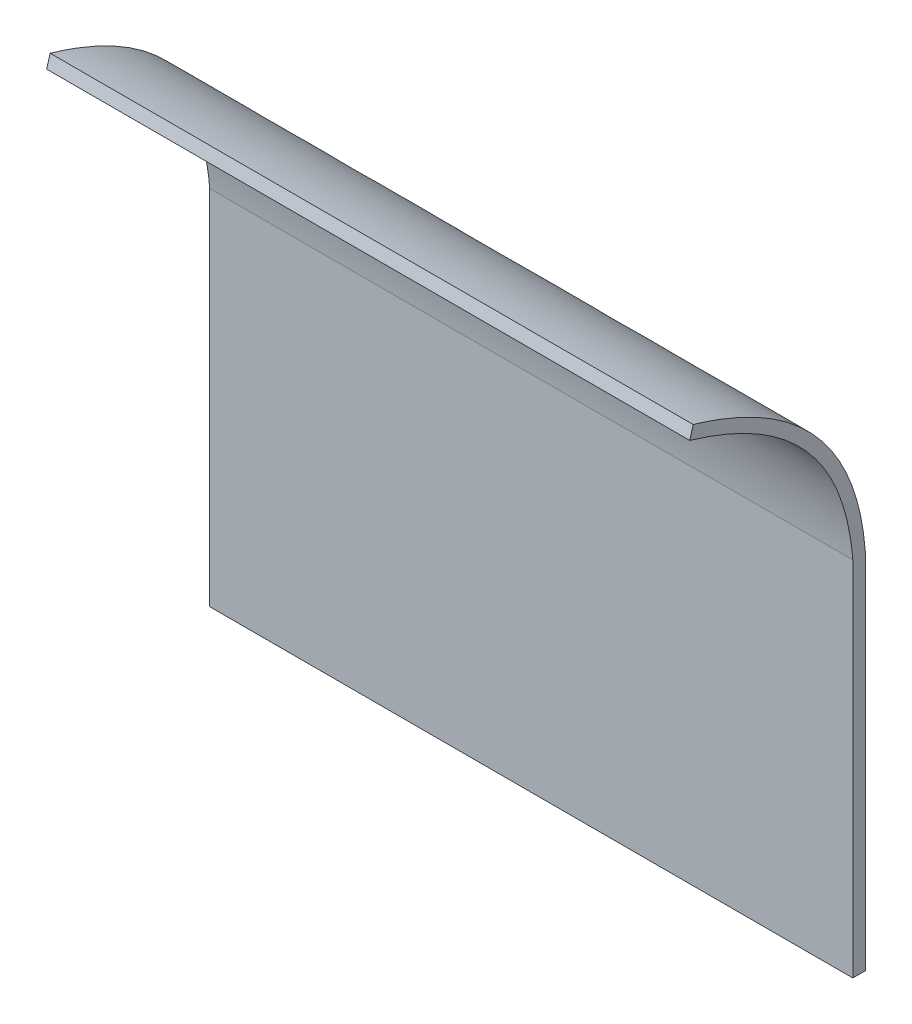
ISO-10303-21;
HEADER;
FILE_DESCRIPTION(('STEP AP214'),'2;1');
FILE_NAME('part.step','',(''),(''),'','','');
FILE_SCHEMA(('AUTOMOTIVE_DESIGN { 1 0 10303 214 1 1 1 1 }'));
ENDSEC;
DATA;
#1=APPLICATION_CONTEXT('core data for automotive mechanical design processes');
#2=APPLICATION_PROTOCOL_DEFINITION('international standard','automotive_design',2000,#1);
#3=PRODUCT_CONTEXT('',#1,'mechanical');
#4=PRODUCT('Part','Part','',(#3));
#5=PRODUCT_RELATED_PRODUCT_CATEGORY('part','',(#4));
#6=PRODUCT_DEFINITION_FORMATION('','',#4);
#7=PRODUCT_DEFINITION_CONTEXT('part definition',#1,'design');
#8=PRODUCT_DEFINITION('design','',#6,#7);
#9=PRODUCT_DEFINITION_SHAPE('','',#8);
#10=(LENGTH_UNIT() NAMED_UNIT(*) SI_UNIT(.MILLI.,.METRE.));
#11=(NAMED_UNIT(*) PLANE_ANGLE_UNIT() SI_UNIT($,.RADIAN.));
#12=(NAMED_UNIT(*) SI_UNIT($,.STERADIAN.) SOLID_ANGLE_UNIT());
#13=UNCERTAINTY_MEASURE_WITH_UNIT(LENGTH_MEASURE(1.E-05),#10,'distance_accuracy_value','');
#14=(GEOMETRIC_REPRESENTATION_CONTEXT(3) GLOBAL_UNCERTAINTY_ASSIGNED_CONTEXT((#13)) GLOBAL_UNIT_ASSIGNED_CONTEXT((#10,
#11,#12)) REPRESENTATION_CONTEXT('',''));
#15=CARTESIAN_POINT('',(0.,0.,0.));
#16=DIRECTION('',(0.,0.,1.));
#17=DIRECTION('',(1.,0.,0.));
#18=AXIS2_PLACEMENT_3D('',#15,#16,#17);
#19=CARTESIAN_POINT('',(102.5,87.1976753279063,7.81603755501328));
#20=CARTESIAN_POINT('',(102.5,84.4866748451525,-1.45819914243898));
#21=CARTESIAN_POINT('',(102.5,76.5134194247029,-11.2355541164942));
#22=CARTESIAN_POINT('',(102.5,66.2372134519051,-17.4936835132744));
#23=CARTESIAN_POINT('',(102.5,57.7198474176655,-18.1758441814915));
#24=B_SPLINE_CURVE_WITH_KNOTS('',2,(#19,#20,#21,#22,#23),.UNSPECIFIED.,.F.,.F.,(3,1,1,3),
(0.581934288562129,0.738708930351331,0.843225358210798,1.),.UNSPECIFIED.);
#25=DIRECTION('',(-1.,0.,0.));
#26=VECTOR('',#25,1.);
#27=SURFACE_OF_LINEAR_EXTRUSION('',#24,#26);
#28=CARTESIAN_POINT('',(0.,87.1976753279063,7.81603755501328));
#29=CARTESIAN_POINT('',(0.,84.4866748451525,-1.45819914243898));
#30=CARTESIAN_POINT('',(0.,76.5134194247029,-11.2355541164942));
#31=CARTESIAN_POINT('',(0.,66.2372134519051,-17.4936835132744));
#32=CARTESIAN_POINT('',(0.,57.7198474176655,-18.1758441814915));
#33=B_SPLINE_CURVE_WITH_KNOTS('',2,(#28,#29,#30,#31,#32),.UNSPECIFIED.,.F.,.F.,(3,1,1,3),
(0.581934288562129,0.738708930351331,0.843225358210798,1.),.UNSPECIFIED.);
#34=CARTESIAN_POINT('',(0.,87.1976753279063,7.81603755501328));
#35=VERTEX_POINT('',#34);
#36=CARTESIAN_POINT('',(0.,57.7198474176655,-18.1758441814915));
#37=VERTEX_POINT('',#36);
#38=EDGE_CURVE('E153',#35,#37,#33,.T.);
#39=ORIENTED_EDGE('',*,*,#38,.T.);
#40=DIRECTION('',(-1.,0.,0.));
#41=VECTOR('',#40,1.);
#42=CARTESIAN_POINT('',(102.5,57.7198474176655,-18.1758441814915));
#43=LINE('',#42,#41);
#44=CARTESIAN_POINT('',(102.5,57.7198474176655,-18.1758441814915));
#45=VERTEX_POINT('',#44);
#46=EDGE_CURVE('E11',#45,#37,#43,.T.);
#47=ORIENTED_EDGE('',*,*,#46,.F.);
#48=CARTESIAN_POINT('',(102.5,87.1976753279063,7.81603755501328));
#49=VERTEX_POINT('',#48);
#50=EDGE_CURVE('E166',#49,#45,#24,.T.);
#51=ORIENTED_EDGE('',*,*,#50,.F.);
#52=DIRECTION('',(-1.,0.,0.));
#53=VECTOR('',#52,1.);
#54=CARTESIAN_POINT('',(102.5,87.1976753279063,7.81603755501328));
#55=LINE('',#54,#53);
#56=EDGE_CURVE('E118',#49,#35,#55,.T.);
#57=ORIENTED_EDGE('',*,*,#56,.T.);
#58=EDGE_LOOP('',(#39,#47,#51,#57));
#59=FACE_BOUND('',#58,.T.);
#60=ADVANCED_FACE('F37',(#59),#27,.F.);
#61=CARTESIAN_POINT('',(102.5,57.7198474176655,-18.1758441814915));
#62=DIRECTION('',(0.,0.,-1.));
#63=DIRECTION('',(0.,1.,0.));
#64=AXIS2_PLACEMENT_3D('',#61,#62,#63);
#65=PLANE('',#64);
#66=DIRECTION('',(0.,-1.,0.));
#67=VECTOR('',#66,1.);
#68=CARTESIAN_POINT('',(0.,57.7198474176655,-18.1758441814915));
#69=LINE('',#68,#67);
#70=CARTESIAN_POINT('',(0.,0.,-18.1758441814915));
#71=VERTEX_POINT('',#70);
#72=EDGE_CURVE('E145',#37,#71,#69,.T.);
#73=ORIENTED_EDGE('',*,*,#72,.T.);
#74=DIRECTION('',(-1.,0.,0.));
#75=VECTOR('',#74,1.);
#76=CARTESIAN_POINT('',(102.5,0.,-18.1758441814915));
#77=LINE('',#76,#75);
#78=CARTESIAN_POINT('',(102.5,0.,-18.1758441814915));
#79=VERTEX_POINT('',#78);
#80=EDGE_CURVE('E46',#79,#71,#77,.T.);
#81=ORIENTED_EDGE('',*,*,#80,.F.);
#82=DIRECTION('',(0.,-1.,0.));
#83=VECTOR('',#82,1.);
#84=CARTESIAN_POINT('',(102.5,57.7198474176655,-18.1758441814915));
#85=LINE('',#84,#83);
#86=EDGE_CURVE('E91',#45,#79,#85,.T.);
#87=ORIENTED_EDGE('',*,*,#86,.F.);
#88=ORIENTED_EDGE('',*,*,#46,.T.);
#89=EDGE_LOOP('',(#73,#81,#87,#88));
#90=FACE_BOUND('',#89,.T.);
#91=ADVANCED_FACE('F138',(#90),#65,.F.);
#92=CARTESIAN_POINT('',(102.5,0.,-20.1758441814915));
#93=DIRECTION('',(0.,1.,0.));
#94=DIRECTION('',(0.,0.,1.));
#95=AXIS2_PLACEMENT_3D('',#92,#93,#94);
#96=PLANE('',#95);
#97=DIRECTION('',(0.,0.,-1.));
#98=VECTOR('',#97,1.);
#99=CARTESIAN_POINT('',(0.,0.,-20.1758441814915));
#100=LINE('',#99,#98);
#101=CARTESIAN_POINT('',(0.,0.,-20.1758441814915));
#102=VERTEX_POINT('',#101);
#103=EDGE_CURVE('E152',#71,#102,#100,.T.);
#104=ORIENTED_EDGE('',*,*,#103,.T.);
#105=DIRECTION('',(-1.,0.,0.));
#106=VECTOR('',#105,1.);
#107=CARTESIAN_POINT('',(102.5,0.,-20.1758441814915));
#108=LINE('',#107,#106);
#109=CARTESIAN_POINT('',(102.5,0.,-20.1758441814915));
#110=VERTEX_POINT('',#109);
#111=EDGE_CURVE('E113',#110,#102,#108,.T.);
#112=ORIENTED_EDGE('',*,*,#111,.F.);
#113=DIRECTION('',(0.,0.,-1.));
#114=VECTOR('',#113,1.);
#115=CARTESIAN_POINT('',(102.5,0.,-20.1758441814915));
#116=LINE('',#115,#114);
#117=EDGE_CURVE('E104',#79,#110,#116,.T.);
#118=ORIENTED_EDGE('',*,*,#117,.F.);
#119=ORIENTED_EDGE('',*,*,#80,.T.);
#120=EDGE_LOOP('',(#104,#112,#118,#119));
#121=FACE_BOUND('',#120,.T.);
#122=ADVANCED_FACE('F136',(#121),#96,.F.);
#123=CARTESIAN_POINT('',(102.5,57.796560731168,-20.1758441814915));
#124=DIRECTION('',(0.,0.,1.));
#125=DIRECTION('',(1.,0.,0.));
#126=AXIS2_PLACEMENT_3D('',#123,#124,#125);
#127=PLANE('',#126);
#128=DIRECTION('',(0.,1.,0.));
#129=VECTOR('',#128,1.);
#130=CARTESIAN_POINT('',(0.,57.796560731168,-20.1758441814915));
#131=LINE('',#130,#129);
#132=CARTESIAN_POINT('',(0.,57.796560731168,-20.1758441814915));
#133=VERTEX_POINT('',#132);
#134=EDGE_CURVE('E112',#102,#133,#131,.T.);
#135=ORIENTED_EDGE('',*,*,#134,.T.);
#136=DIRECTION('',(-1.,0.,0.));
#137=VECTOR('',#136,1.);
#138=CARTESIAN_POINT('',(102.5,57.796560731168,-20.1758441814915));
#139=LINE('',#138,#137);
#140=CARTESIAN_POINT('',(102.5,57.796560731168,-20.1758441814915));
#141=VERTEX_POINT('',#140);
#142=EDGE_CURVE('E109',#141,#133,#139,.T.);
#143=ORIENTED_EDGE('',*,*,#142,.F.);
#144=DIRECTION('',(0.,1.,0.));
#145=VECTOR('',#144,1.);
#146=CARTESIAN_POINT('',(102.5,57.796560731168,-20.1758441814915));
#147=LINE('',#146,#145);
#148=EDGE_CURVE('E98',#110,#141,#147,.T.);
#149=ORIENTED_EDGE('',*,*,#148,.F.);
#150=ORIENTED_EDGE('',*,*,#111,.T.);
#151=EDGE_LOOP('',(#135,#143,#149,#150));
#152=FACE_BOUND('',#151,.T.);
#153=ADVANCED_FACE('F110',(#152),#127,.F.);
#154=CARTESIAN_POINT('',(102.5,57.796560731168,-20.1758441814915));
#155=CARTESIAN_POINT('',(102.5,81.6963399003061,-18.3600041809931));
#156=CARTESIAN_POINT('',(102.5,89.1186802484812,7.25949456913799));
#157=B_SPLINE_CURVE_WITH_KNOTS('',2,(#154,#155,#156),.UNSPECIFIED.,.F.,.F.,(3,3),
(0.581248730237877,1.),.UNSPECIFIED.);
#158=DIRECTION('',(-1.,0.,0.));
#159=VECTOR('',#158,1.);
#160=SURFACE_OF_LINEAR_EXTRUSION('',#157,#159);
#161=CARTESIAN_POINT('',(0.,57.796560731168,-20.1758441814915));
#162=CARTESIAN_POINT('',(0.,81.6963399003061,-18.3600041809931));
#163=CARTESIAN_POINT('',(0.,89.1186802484812,7.25949456913799));
#164=B_SPLINE_CURVE_WITH_KNOTS('',2,(#161,#162,#163),.UNSPECIFIED.,.F.,.F.,(3,3),
(0.581248730237877,1.),.UNSPECIFIED.);
#165=CARTESIAN_POINT('',(0.,89.1186802484812,7.25949456913799));
#166=VERTEX_POINT('',#165);
#167=EDGE_CURVE('E77',#133,#166,#164,.T.);
#168=ORIENTED_EDGE('',*,*,#167,.T.);
#169=DIRECTION('',(-1.,0.,0.));
#170=VECTOR('',#169,1.);
#171=CARTESIAN_POINT('',(102.5,89.1186802484812,7.25949456913799));
#172=LINE('',#171,#170);
#173=CARTESIAN_POINT('',(102.5,89.1186802484812,7.25949456913799));
#174=VERTEX_POINT('',#173);
#175=EDGE_CURVE('E114',#174,#166,#172,.T.);
#176=ORIENTED_EDGE('',*,*,#175,.F.);
#177=EDGE_CURVE('E102',#141,#174,#157,.T.);
#178=ORIENTED_EDGE('',*,*,#177,.F.);
#179=ORIENTED_EDGE('',*,*,#142,.T.);
#180=EDGE_LOOP('',(#168,#176,#178,#179));
#181=FACE_BOUND('',#180,.T.);
#182=ADVANCED_FACE('F116',(#181),#160,.F.);
#183=CARTESIAN_POINT('',(102.5,89.1186802484812,7.25949456913799));
#184=DIRECTION('',(0.,-0.278271492937643,-0.960502460287456));
#185=DIRECTION('',(0.,0.960502460287456,-0.278271492937643));
#186=AXIS2_PLACEMENT_3D('',#183,#184,#185);
#187=PLANE('',#186);
#188=DIRECTION('',(0.,-0.960502460287456,0.278271492937643));
#189=VECTOR('',#188,1.);
#190=CARTESIAN_POINT('',(0.,89.1186802484812,7.25949456913799));
#191=LINE('',#190,#189);
#192=EDGE_CURVE('E83',#166,#35,#191,.T.);
#193=ORIENTED_EDGE('',*,*,#192,.T.);
#194=ORIENTED_EDGE('',*,*,#56,.F.);
#195=DIRECTION('',(0.,-0.960502460287456,0.278271492937643));
#196=VECTOR('',#195,1.);
#197=CARTESIAN_POINT('',(102.5,89.1186802484812,7.25949456913799));
#198=LINE('',#197,#196);
#199=EDGE_CURVE('E54',#174,#49,#198,.T.);
#200=ORIENTED_EDGE('',*,*,#199,.F.);
#201=ORIENTED_EDGE('',*,*,#175,.T.);
#202=EDGE_LOOP('',(#193,#194,#200,#201));
#203=FACE_BOUND('',#202,.T.);
#204=ADVANCED_FACE('F132',(#203),#187,.F.);
#205=CARTESIAN_POINT('',(102.5,76.2831243694681,-10.8836315587667));
#206=DIRECTION('',(1.,0.,0.));
#207=DIRECTION('',(0.,0.,-1.));
#208=AXIS2_PLACEMENT_3D('',#205,#206,#207);
#209=PLANE('',#208);
#210=ORIENTED_EDGE('',*,*,#50,.T.);
#211=ORIENTED_EDGE('',*,*,#86,.T.);
#212=ORIENTED_EDGE('',*,*,#117,.T.);
#213=ORIENTED_EDGE('',*,*,#148,.T.);
#214=ORIENTED_EDGE('',*,*,#177,.T.);
#215=ORIENTED_EDGE('',*,*,#199,.T.);
#216=EDGE_LOOP('',(#210,#211,#212,#213,#214,#215));
#217=FACE_BOUND('',#216,.T.);
#218=ADVANCED_FACE('F100',(#217),#209,.T.);
#219=CARTESIAN_POINT('',(0.,76.2831243694681,-10.8836315587667));
#220=DIRECTION('',(1.,0.,0.));
#221=DIRECTION('',(0.,0.,-1.));
#222=AXIS2_PLACEMENT_3D('',#219,#220,#221);
#223=PLANE('',#222);
#224=ORIENTED_EDGE('',*,*,#38,.F.);
#225=ORIENTED_EDGE('',*,*,#192,.F.);
#226=ORIENTED_EDGE('',*,*,#167,.F.);
#227=ORIENTED_EDGE('',*,*,#134,.F.);
#228=ORIENTED_EDGE('',*,*,#103,.F.);
#229=ORIENTED_EDGE('',*,*,#72,.F.);
#230=EDGE_LOOP('',(#224,#225,#226,#227,#228,#229));
#231=FACE_BOUND('',#230,.T.);
#232=ADVANCED_FACE('F155',(#231),#223,.F.);
#233=CLOSED_SHELL('',(#60,#91,#122,#153,#182,#204,#218,#232));
#234=MANIFOLD_SOLID_BREP('B2',#233);
#235=ADVANCED_BREP_SHAPE_REPRESENTATION('',(#18,#234),#14);
#236=SHAPE_DEFINITION_REPRESENTATION(#9,#235);
ENDSEC;
END-ISO-10303-21;
